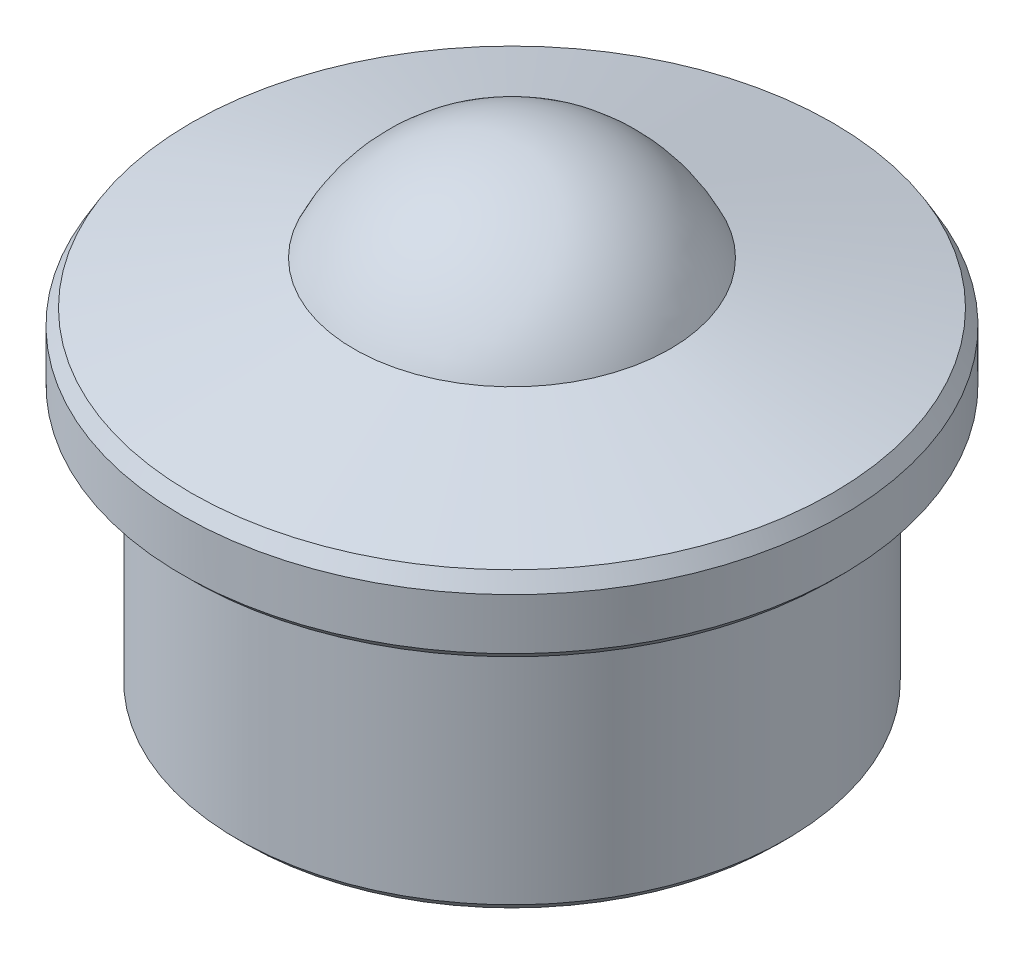
ISO-10303-21;
HEADER;
FILE_DESCRIPTION(('STEP AP214'),'2;1');
FILE_NAME('part.step','',(''),(''),'','','');
FILE_SCHEMA(('AUTOMOTIVE_DESIGN { 1 0 10303 214 1 1 1 1 }'));
ENDSEC;
DATA;
#1=APPLICATION_CONTEXT('core data for automotive mechanical design processes');
#2=APPLICATION_PROTOCOL_DEFINITION('international standard','automotive_design',2000,#1);
#3=PRODUCT_CONTEXT('',#1,'mechanical');
#4=PRODUCT('Part','Part','',(#3));
#5=PRODUCT_RELATED_PRODUCT_CATEGORY('part','',(#4));
#6=PRODUCT_DEFINITION_FORMATION('','',#4);
#7=PRODUCT_DEFINITION_CONTEXT('part definition',#1,'design');
#8=PRODUCT_DEFINITION('design','',#6,#7);
#9=PRODUCT_DEFINITION_SHAPE('','',#8);
#10=(LENGTH_UNIT() NAMED_UNIT(*) SI_UNIT(.MILLI.,.METRE.));
#11=(NAMED_UNIT(*) PLANE_ANGLE_UNIT() SI_UNIT($,.RADIAN.));
#12=(NAMED_UNIT(*) SI_UNIT($,.STERADIAN.) SOLID_ANGLE_UNIT());
#13=UNCERTAINTY_MEASURE_WITH_UNIT(LENGTH_MEASURE(1.E-05),#10,'distance_accuracy_value','');
#14=(GEOMETRIC_REPRESENTATION_CONTEXT(3) GLOBAL_UNCERTAINTY_ASSIGNED_CONTEXT((#13)) GLOBAL_UNIT_ASSIGNED_CONTEXT((#10,
#11,#12)) REPRESENTATION_CONTEXT('',''));
#15=CARTESIAN_POINT('',(0.,0.,0.));
#16=DIRECTION('',(0.,0.,1.));
#17=DIRECTION('',(1.,0.,0.));
#18=AXIS2_PLACEMENT_3D('',#15,#16,#17);
#19=CARTESIAN_POINT('',(0.,0.,0.));
#20=DIRECTION('',(0.,-1.,0.));
#21=DIRECTION('',(0.,0.,-1.));
#22=AXIS2_PLACEMENT_3D('',#19,#20,#21);
#23=PLANE('',#22);
#24=CARTESIAN_POINT('',(0.,0.,0.));
#25=DIRECTION('',(0.,-1.,0.));
#26=DIRECTION('',(0.,0.,-1.));
#27=AXIS2_PLACEMENT_3D('',#24,#25,#26);
#28=CIRCLE('',#27,14.5);
#29=CARTESIAN_POINT('',(0.,0.,-14.5));
#30=VERTEX_POINT('',#29);
#31=EDGE_CURVE('E63',#30,#30,#28,.T.);
#32=ORIENTED_EDGE('',*,*,#31,.T.);
#33=EDGE_LOOP('',(#32));
#34=FACE_BOUND('',#33,.T.);
#35=ADVANCED_FACE('F39',(#34),#23,.T.);
#36=CARTESIAN_POINT('',(0.,0.,0.));
#37=DIRECTION('',(0.,-1.,0.));
#38=DIRECTION('',(0.,0.,-1.));
#39=AXIS2_PLACEMENT_3D('',#36,#37,#38);
#40=CYLINDRICAL_SURFACE('',#39,15.);
#41=CARTESIAN_POINT('',(0.,0.499999999999997,0.));
#42=DIRECTION('',(0.,-1.,0.));
#43=DIRECTION('',(0.,0.,-1.));
#44=AXIS2_PLACEMENT_3D('',#41,#42,#43);
#45=CIRCLE('',#44,15.);
#46=CARTESIAN_POINT('',(0.,0.499999999999997,-15.));
#47=VERTEX_POINT('',#46);
#48=EDGE_CURVE('E60',#47,#47,#45,.F.);
#49=ORIENTED_EDGE('',*,*,#48,.T.);
#50=EDGE_LOOP('',(#49));
#51=FACE_BOUND('',#50,.T.);
#52=CARTESIAN_POINT('',(0.,14.,0.));
#53=DIRECTION('',(0.,-1.,0.));
#54=DIRECTION('',(0.,0.,-1.));
#55=AXIS2_PLACEMENT_3D('',#52,#53,#54);
#56=CIRCLE('',#55,15.);
#57=CARTESIAN_POINT('',(0.,14.,-15.));
#58=VERTEX_POINT('',#57);
#59=EDGE_CURVE('E66',#58,#58,#56,.T.);
#60=ORIENTED_EDGE('',*,*,#59,.T.);
#61=EDGE_LOOP('',(#60));
#62=FACE_BOUND('',#61,.T.);
#63=ADVANCED_FACE('F89',(#51,#62),#40,.T.);
#64=CARTESIAN_POINT('',(15.,14.,0.));
#65=DIRECTION('',(0.,-1.,0.));
#66=DIRECTION('',(0.,0.,-1.));
#67=AXIS2_PLACEMENT_3D('',#64,#65,#66);
#68=PLANE('',#67);
#69=CARTESIAN_POINT('',(0.,14.,0.));
#70=DIRECTION('',(0.,-1.,0.));
#71=DIRECTION('',(0.,0.,-1.));
#72=AXIS2_PLACEMENT_3D('',#69,#70,#71);
#73=CIRCLE('',#72,17.5);
#74=CARTESIAN_POINT('',(0.,14.,-17.5));
#75=VERTEX_POINT('',#74);
#76=EDGE_CURVE('E55',#75,#75,#73,.T.);
#77=ORIENTED_EDGE('',*,*,#76,.T.);
#78=EDGE_LOOP('',(#77));
#79=FACE_BOUND('',#78,.T.);
#80=ORIENTED_EDGE('',*,*,#59,.F.);
#81=EDGE_LOOP('',(#80));
#82=FACE_BOUND('',#81,.T.);
#83=ADVANCED_FACE('F95',(#79,#82),#68,.T.);
#84=CARTESIAN_POINT('',(0.,0.,0.));
#85=DIRECTION('',(0.,-1.,0.));
#86=DIRECTION('',(0.,0.,-1.));
#87=AXIS2_PLACEMENT_3D('',#84,#85,#86);
#88=CYLINDRICAL_SURFACE('',#87,18.);
#89=CARTESIAN_POINT('',(0.,14.5,0.));
#90=DIRECTION('',(0.,-1.,0.));
#91=DIRECTION('',(0.,0.,-1.));
#92=AXIS2_PLACEMENT_3D('',#89,#90,#91);
#93=CIRCLE('',#92,18.);
#94=CARTESIAN_POINT('',(0.,14.5,-18.));
#95=VERTEX_POINT('',#94);
#96=EDGE_CURVE('E47',#95,#95,#93,.F.);
#97=ORIENTED_EDGE('',*,*,#96,.T.);
#98=EDGE_LOOP('',(#97));
#99=FACE_BOUND('',#98,.T.);
#100=CARTESIAN_POINT('',(0.,17.2941033700713,0.));
#101=DIRECTION('',(0.,1.,0.));
#102=DIRECTION('',(0.,0.,1.));
#103=AXIS2_PLACEMENT_3D('',#100,#101,#102);
#104=CIRCLE('',#103,18.);
#105=CARTESIAN_POINT('',(0.,17.2941033700713,18.));
#106=VERTEX_POINT('',#105);
#107=EDGE_CURVE('E51',#106,#106,#104,.F.);
#108=ORIENTED_EDGE('',*,*,#107,.T.);
#109=EDGE_LOOP('',(#108));
#110=FACE_BOUND('',#109,.T.);
#111=ADVANCED_FACE('F86',(#99,#110),#88,.T.);
#112=CARTESIAN_POINT('',(0.,18.,0.));
#113=DIRECTION('',(0.,-1.,0.));
#114=DIRECTION('',(0.,0.,-1.));
#115=AXIS2_PLACEMENT_3D('',#112,#113,#114);
#116=CONICAL_SURFACE('',#115,18.,1.30998700040628);
#117=CARTESIAN_POINT('',(0.,18.1289312962614,0.));
#118=DIRECTION('',(0.,1.,0.));
#119=DIRECTION('',(0.,0.,1.));
#120=AXIS2_PLACEMENT_3D('',#117,#118,#119);
#121=CIRCLE('',#120,17.5169092002073);
#122=CARTESIAN_POINT('',(0.,18.1289312962614,17.5169092002073));
#123=VERTEX_POINT('',#122);
#124=EDGE_CURVE('E10',#123,#123,#121,.T.);
#125=ORIENTED_EDGE('',*,*,#124,.T.);
#126=EDGE_LOOP('',(#125));
#127=FACE_BOUND('',#126,.T.);
#128=CARTESIAN_POINT('',(0.,20.5,0.));
#129=DIRECTION('',(0.,-1.,0.));
#130=DIRECTION('',(0.,0.,-1.));
#131=AXIS2_PLACEMENT_3D('',#128,#129,#130);
#132=CIRCLE('',#131,8.6327863404581);
#133=CARTESIAN_POINT('',(0.,20.5,-8.6327863404581));
#134=VERTEX_POINT('',#133);
#135=EDGE_CURVE('E69',#134,#134,#132,.T.);
#136=ORIENTED_EDGE('',*,*,#135,.T.);
#137=EDGE_LOOP('',(#136));
#138=FACE_BOUND('',#137,.T.);
#139=ADVANCED_FACE('F73',(#127,#138),#116,.T.);
#140=CARTESIAN_POINT('',(0.,16.475,0.));
#141=DIRECTION('',(0.,-1.,0.));
#142=DIRECTION('',(1.,0.,0.));
#143=AXIS2_PLACEMENT_3D('',#140,#141,#142);
#144=SPHERICAL_SURFACE('',#143,9.525);
#145=ORIENTED_EDGE('',*,*,#135,.F.);
#146=EDGE_LOOP('',(#145));
#147=FACE_BOUND('',#146,.T.);
#148=ADVANCED_FACE('F75',(#147),#144,.T.);
#149=CARTESIAN_POINT('',(0.,0.,0.));
#150=DIRECTION('',(0.,1.,0.));
#151=DIRECTION('',(0.,0.,1.));
#152=AXIS2_PLACEMENT_3D('',#149,#150,#151);
#153=CONICAL_SURFACE('',#152,14.5,0.78539816339745);
#154=ORIENTED_EDGE('',*,*,#48,.F.);
#155=EDGE_LOOP('',(#154));
#156=FACE_BOUND('',#155,.T.);
#157=ORIENTED_EDGE('',*,*,#31,.F.);
#158=EDGE_LOOP('',(#157));
#159=FACE_BOUND('',#158,.T.);
#160=ADVANCED_FACE('F77',(#156,#159),#153,.T.);
#161=CARTESIAN_POINT('',(0.,14.,0.));
#162=DIRECTION('',(0.,1.,0.));
#163=DIRECTION('',(0.,0.,1.));
#164=AXIS2_PLACEMENT_3D('',#161,#162,#163);
#165=CONICAL_SURFACE('',#164,17.5,0.785398163397441);
#166=ORIENTED_EDGE('',*,*,#96,.F.);
#167=EDGE_LOOP('',(#166));
#168=FACE_BOUND('',#167,.T.);
#169=ORIENTED_EDGE('',*,*,#76,.F.);
#170=EDGE_LOOP('',(#169));
#171=FACE_BOUND('',#170,.T.);
#172=ADVANCED_FACE('F83',(#168,#171),#165,.T.);
#173=CARTESIAN_POINT('',(0.,17.2941033700713,0.));
#174=DIRECTION('',(0.,-1.,0.));
#175=DIRECTION('',(0.,0.,-1.));
#176=AXIS2_PLACEMENT_3D('',#173,#174,#175);
#177=CONICAL_SURFACE('',#176,18.,0.524588837008843);
#178=ORIENTED_EDGE('',*,*,#124,.F.);
#179=EDGE_LOOP('',(#178));
#180=FACE_BOUND('',#179,.T.);
#181=ORIENTED_EDGE('',*,*,#107,.F.);
#182=EDGE_LOOP('',(#181));
#183=FACE_BOUND('',#182,.T.);
#184=ADVANCED_FACE('F42',(#180,#183),#177,.T.);
#185=CLOSED_SHELL('',(#35,#63,#83,#111,#139,#148,#160,#172,#184));
#186=MANIFOLD_SOLID_BREP('B2',#185);
#187=ADVANCED_BREP_SHAPE_REPRESENTATION('',(#18,#186),#14);
#188=SHAPE_DEFINITION_REPRESENTATION(#9,#187);
ENDSEC;
END-ISO-10303-21;
